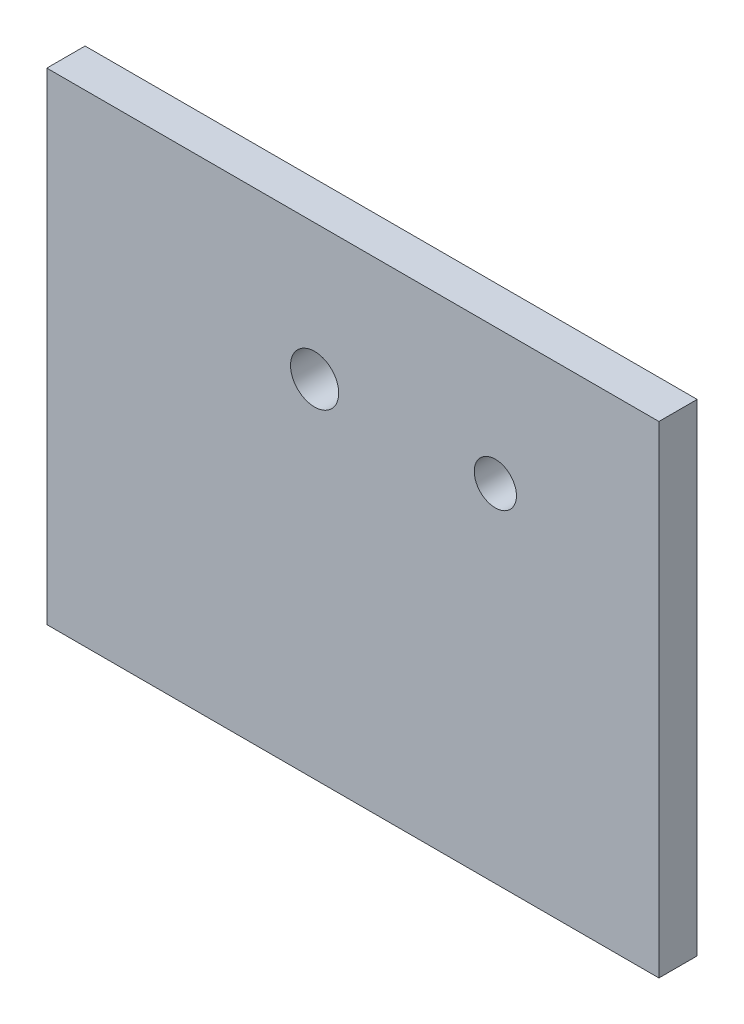
ISO-10303-21;
HEADER;
FILE_DESCRIPTION(('STEP AP214'),'2;1');
FILE_NAME('part.step','',(''),(''),'','','');
FILE_SCHEMA(('AUTOMOTIVE_DESIGN { 1 0 10303 214 1 1 1 1 }'));
ENDSEC;
DATA;
#1=APPLICATION_CONTEXT('core data for automotive mechanical design processes');
#2=APPLICATION_PROTOCOL_DEFINITION('international standard','automotive_design',2000,#1);
#3=PRODUCT_CONTEXT('',#1,'mechanical');
#4=PRODUCT('Part','Part','',(#3));
#5=PRODUCT_RELATED_PRODUCT_CATEGORY('part','',(#4));
#6=PRODUCT_DEFINITION_FORMATION('','',#4);
#7=PRODUCT_DEFINITION_CONTEXT('part definition',#1,'design');
#8=PRODUCT_DEFINITION('design','',#6,#7);
#9=PRODUCT_DEFINITION_SHAPE('','',#8);
#10=(LENGTH_UNIT() NAMED_UNIT(*) SI_UNIT(.MILLI.,.METRE.));
#11=(NAMED_UNIT(*) PLANE_ANGLE_UNIT() SI_UNIT($,.RADIAN.));
#12=(NAMED_UNIT(*) SI_UNIT($,.STERADIAN.) SOLID_ANGLE_UNIT());
#13=UNCERTAINTY_MEASURE_WITH_UNIT(LENGTH_MEASURE(1.E-05),#10,'distance_accuracy_value','');
#14=(GEOMETRIC_REPRESENTATION_CONTEXT(3) GLOBAL_UNCERTAINTY_ASSIGNED_CONTEXT((#13)) GLOBAL_UNIT_ASSIGNED_CONTEXT((#10,
#11,#12)) REPRESENTATION_CONTEXT('',''));
#15=CARTESIAN_POINT('',(0.,0.,0.));
#16=DIRECTION('',(0.,0.,1.));
#17=DIRECTION('',(1.,0.,0.));
#18=AXIS2_PLACEMENT_3D('',#15,#16,#17);
#19=CARTESIAN_POINT('',(0.,0.,6.35));
#20=DIRECTION('',(0.,0.,1.));
#21=DIRECTION('',(1.,0.,0.));
#22=AXIS2_PLACEMENT_3D('',#19,#20,#21);
#23=PLANE('',#22);
#24=CARTESIAN_POINT('',(74.45,-22.5,6.35));
#25=DIRECTION('',(0.,0.,1.));
#26=DIRECTION('',(1.,0.,0.));
#27=AXIS2_PLACEMENT_3D('',#24,#25,#26);
#28=CIRCLE('',#27,3.50000000000001);
#29=CARTESIAN_POINT('',(77.95,-22.5,6.35));
#30=VERTEX_POINT('',#29);
#31=EDGE_CURVE('E100',#30,#30,#28,.T.);
#32=ORIENTED_EDGE('',*,*,#31,.F.);
#33=EDGE_LOOP('',(#32));
#34=FACE_BOUND('',#33,.T.);
#35=DIRECTION('',(0.,-1.,0.));
#36=VECTOR('',#35,1.);
#37=CARTESIAN_POINT('',(0.,0.,6.35));
#38=LINE('',#37,#36);
#39=CARTESIAN_POINT('',(0.,0.,6.35));
#40=VERTEX_POINT('',#39);
#41=CARTESIAN_POINT('',(0.,-80.,6.35));
#42=VERTEX_POINT('',#41);
#43=EDGE_CURVE('E85',#40,#42,#38,.T.);
#44=ORIENTED_EDGE('',*,*,#43,.T.);
#45=DIRECTION('',(1.,0.,0.));
#46=VECTOR('',#45,1.);
#47=CARTESIAN_POINT('',(0.,-80.,6.35));
#48=LINE('',#47,#46);
#49=CARTESIAN_POINT('',(101.6,-80.,6.35));
#50=VERTEX_POINT('',#49);
#51=EDGE_CURVE('E80',#42,#50,#48,.T.);
#52=ORIENTED_EDGE('',*,*,#51,.T.);
#53=DIRECTION('',(0.,1.,0.));
#54=VECTOR('',#53,1.);
#55=CARTESIAN_POINT('',(101.6,0.,6.35));
#56=LINE('',#55,#54);
#57=CARTESIAN_POINT('',(101.6,0.,6.35));
#58=VERTEX_POINT('',#57);
#59=EDGE_CURVE('E83',#50,#58,#56,.T.);
#60=ORIENTED_EDGE('',*,*,#59,.T.);
#61=DIRECTION('',(-1.,0.,0.));
#62=VECTOR('',#61,1.);
#63=CARTESIAN_POINT('',(0.,0.,6.35));
#64=LINE('',#63,#62);
#65=EDGE_CURVE('E50',#58,#40,#64,.T.);
#66=ORIENTED_EDGE('',*,*,#65,.T.);
#67=EDGE_LOOP('',(#44,#52,#60,#66));
#68=FACE_BOUND('',#67,.T.);
#69=CARTESIAN_POINT('',(44.45,-22.5,6.35));
#70=DIRECTION('',(0.,0.,1.));
#71=DIRECTION('',(1.,0.,0.));
#72=AXIS2_PLACEMENT_3D('',#69,#70,#71);
#73=CIRCLE('',#72,4.00000000000001);
#74=CARTESIAN_POINT('',(48.45,-22.5,6.35));
#75=VERTEX_POINT('',#74);
#76=EDGE_CURVE('E115',#75,#75,#73,.T.);
#77=ORIENTED_EDGE('',*,*,#76,.F.);
#78=EDGE_LOOP('',(#77));
#79=FACE_BOUND('',#78,.T.);
#80=ADVANCED_FACE('F33',(#34,#68,#79),#23,.T.);
#81=CARTESIAN_POINT('',(0.,0.,0.));
#82=DIRECTION('',(0.,0.,1.));
#83=DIRECTION('',(1.,0.,0.));
#84=AXIS2_PLACEMENT_3D('',#81,#82,#83);
#85=PLANE('',#84);
#86=DIRECTION('',(0.,-1.,0.));
#87=VECTOR('',#86,1.);
#88=CARTESIAN_POINT('',(0.,0.,0.));
#89=LINE('',#88,#87);
#90=CARTESIAN_POINT('',(0.,0.,0.));
#91=VERTEX_POINT('',#90);
#92=CARTESIAN_POINT('',(0.,-80.,0.));
#93=VERTEX_POINT('',#92);
#94=EDGE_CURVE('E97',#91,#93,#89,.T.);
#95=ORIENTED_EDGE('',*,*,#94,.F.);
#96=DIRECTION('',(-1.,0.,0.));
#97=VECTOR('',#96,1.);
#98=CARTESIAN_POINT('',(0.,0.,0.));
#99=LINE('',#98,#97);
#100=CARTESIAN_POINT('',(101.6,0.,0.));
#101=VERTEX_POINT('',#100);
#102=EDGE_CURVE('E73',#101,#91,#99,.T.);
#103=ORIENTED_EDGE('',*,*,#102,.F.);
#104=DIRECTION('',(0.,1.,0.));
#105=VECTOR('',#104,1.);
#106=CARTESIAN_POINT('',(101.6,0.,0.));
#107=LINE('',#106,#105);
#108=CARTESIAN_POINT('',(101.6,-80.,0.));
#109=VERTEX_POINT('',#108);
#110=EDGE_CURVE('E67',#109,#101,#107,.T.);
#111=ORIENTED_EDGE('',*,*,#110,.F.);
#112=DIRECTION('',(1.,0.,0.));
#113=VECTOR('',#112,1.);
#114=CARTESIAN_POINT('',(0.,-80.,0.));
#115=LINE('',#114,#113);
#116=EDGE_CURVE('E89',#93,#109,#115,.T.);
#117=ORIENTED_EDGE('',*,*,#116,.F.);
#118=EDGE_LOOP('',(#95,#103,#111,#117));
#119=FACE_BOUND('',#118,.T.);
#120=CARTESIAN_POINT('',(74.45,-22.5,0.));
#121=DIRECTION('',(0.,0.,1.));
#122=DIRECTION('',(1.,0.,0.));
#123=AXIS2_PLACEMENT_3D('',#120,#121,#122);
#124=CIRCLE('',#123,3.50000000000001);
#125=CARTESIAN_POINT('',(77.95,-22.5,0.));
#126=VERTEX_POINT('',#125);
#127=EDGE_CURVE('E112',#126,#126,#124,.T.);
#128=ORIENTED_EDGE('',*,*,#127,.T.);
#129=EDGE_LOOP('',(#128));
#130=FACE_BOUND('',#129,.T.);
#131=CARTESIAN_POINT('',(44.45,-22.5,0.));
#132=DIRECTION('',(0.,0.,1.));
#133=DIRECTION('',(1.,0.,0.));
#134=AXIS2_PLACEMENT_3D('',#131,#132,#133);
#135=CIRCLE('',#134,4.00000000000001);
#136=CARTESIAN_POINT('',(48.45,-22.5,0.));
#137=VERTEX_POINT('',#136);
#138=EDGE_CURVE('E118',#137,#137,#135,.T.);
#139=ORIENTED_EDGE('',*,*,#138,.T.);
#140=EDGE_LOOP('',(#139));
#141=FACE_BOUND('',#140,.T.);
#142=ADVANCED_FACE('F108',(#119,#130,#141),#85,.F.);
#143=CARTESIAN_POINT('',(0.,0.,6.35));
#144=DIRECTION('',(1.,0.,0.));
#145=DIRECTION('',(0.,0.,-1.));
#146=AXIS2_PLACEMENT_3D('',#143,#144,#145);
#147=PLANE('',#146);
#148=ORIENTED_EDGE('',*,*,#94,.T.);
#149=DIRECTION('',(0.,0.,-1.));
#150=VECTOR('',#149,1.);
#151=CARTESIAN_POINT('',(0.,-80.,6.35));
#152=LINE('',#151,#150);
#153=EDGE_CURVE('E11',#42,#93,#152,.T.);
#154=ORIENTED_EDGE('',*,*,#153,.F.);
#155=ORIENTED_EDGE('',*,*,#43,.F.);
#156=DIRECTION('',(0.,0.,-1.));
#157=VECTOR('',#156,1.);
#158=CARTESIAN_POINT('',(0.,0.,6.35));
#159=LINE('',#158,#157);
#160=EDGE_CURVE('E93',#40,#91,#159,.T.);
#161=ORIENTED_EDGE('',*,*,#160,.T.);
#162=EDGE_LOOP('',(#148,#154,#155,#161));
#163=FACE_BOUND('',#162,.T.);
#164=ADVANCED_FACE('F35',(#163),#147,.F.);
#165=CARTESIAN_POINT('',(0.,-80.,6.35));
#166=DIRECTION('',(0.,1.,0.));
#167=DIRECTION('',(0.,0.,1.));
#168=AXIS2_PLACEMENT_3D('',#165,#166,#167);
#169=PLANE('',#168);
#170=ORIENTED_EDGE('',*,*,#116,.T.);
#171=DIRECTION('',(0.,0.,-1.));
#172=VECTOR('',#171,1.);
#173=CARTESIAN_POINT('',(101.6,-80.,6.35));
#174=LINE('',#173,#172);
#175=EDGE_CURVE('E42',#50,#109,#174,.T.);
#176=ORIENTED_EDGE('',*,*,#175,.F.);
#177=ORIENTED_EDGE('',*,*,#51,.F.);
#178=ORIENTED_EDGE('',*,*,#153,.T.);
#179=EDGE_LOOP('',(#170,#176,#177,#178));
#180=FACE_BOUND('',#179,.T.);
#181=ADVANCED_FACE('F88',(#180),#169,.F.);
#182=CARTESIAN_POINT('',(101.6,0.,6.35));
#183=DIRECTION('',(-1.,0.,0.));
#184=DIRECTION('',(0.,-1.,0.));
#185=AXIS2_PLACEMENT_3D('',#182,#183,#184);
#186=PLANE('',#185);
#187=ORIENTED_EDGE('',*,*,#110,.T.);
#188=DIRECTION('',(0.,0.,-1.));
#189=VECTOR('',#188,1.);
#190=CARTESIAN_POINT('',(101.6,0.,6.35));
#191=LINE('',#190,#189);
#192=EDGE_CURVE('E90',#58,#101,#191,.T.);
#193=ORIENTED_EDGE('',*,*,#192,.F.);
#194=ORIENTED_EDGE('',*,*,#59,.F.);
#195=ORIENTED_EDGE('',*,*,#175,.T.);
#196=EDGE_LOOP('',(#187,#193,#194,#195));
#197=FACE_BOUND('',#196,.T.);
#198=ADVANCED_FACE('F91',(#197),#186,.F.);
#199=CARTESIAN_POINT('',(0.,0.,6.35));
#200=DIRECTION('',(0.,-1.,0.));
#201=DIRECTION('',(1.,0.,0.));
#202=AXIS2_PLACEMENT_3D('',#199,#200,#201);
#203=PLANE('',#202);
#204=ORIENTED_EDGE('',*,*,#102,.T.);
#205=ORIENTED_EDGE('',*,*,#160,.F.);
#206=ORIENTED_EDGE('',*,*,#65,.F.);
#207=ORIENTED_EDGE('',*,*,#192,.T.);
#208=EDGE_LOOP('',(#204,#205,#206,#207));
#209=FACE_BOUND('',#208,.T.);
#210=ADVANCED_FACE('F105',(#209),#203,.F.);
#211=CARTESIAN_POINT('',(74.45,-22.5,6.35));
#212=DIRECTION('',(0.,0.,-1.));
#213=DIRECTION('',(-1.,0.,0.));
#214=AXIS2_PLACEMENT_3D('',#211,#212,#213);
#215=CYLINDRICAL_SURFACE('',#214,3.50000000000001);
#216=ORIENTED_EDGE('',*,*,#31,.T.);
#217=EDGE_LOOP('',(#216));
#218=FACE_BOUND('',#217,.T.);
#219=ORIENTED_EDGE('',*,*,#127,.F.);
#220=EDGE_LOOP('',(#219));
#221=FACE_BOUND('',#220,.T.);
#222=ADVANCED_FACE('F135',(#218,#221),#215,.F.);
#223=CARTESIAN_POINT('',(44.45,-22.5,6.35));
#224=DIRECTION('',(0.,0.,-1.));
#225=DIRECTION('',(-1.,0.,0.));
#226=AXIS2_PLACEMENT_3D('',#223,#224,#225);
#227=CYLINDRICAL_SURFACE('',#226,4.00000000000001);
#228=ORIENTED_EDGE('',*,*,#76,.T.);
#229=EDGE_LOOP('',(#228));
#230=FACE_BOUND('',#229,.T.);
#231=ORIENTED_EDGE('',*,*,#138,.F.);
#232=EDGE_LOOP('',(#231));
#233=FACE_BOUND('',#232,.T.);
#234=ADVANCED_FACE('F124',(#230,#233),#227,.F.);
#235=CLOSED_SHELL('',(#80,#142,#164,#181,#198,#210,#222,#234));
#236=MANIFOLD_SOLID_BREP('B2',#235);
#237=ADVANCED_BREP_SHAPE_REPRESENTATION('',(#18,#236),#14);
#238=SHAPE_DEFINITION_REPRESENTATION(#9,#237);
ENDSEC;
END-ISO-10303-21;
